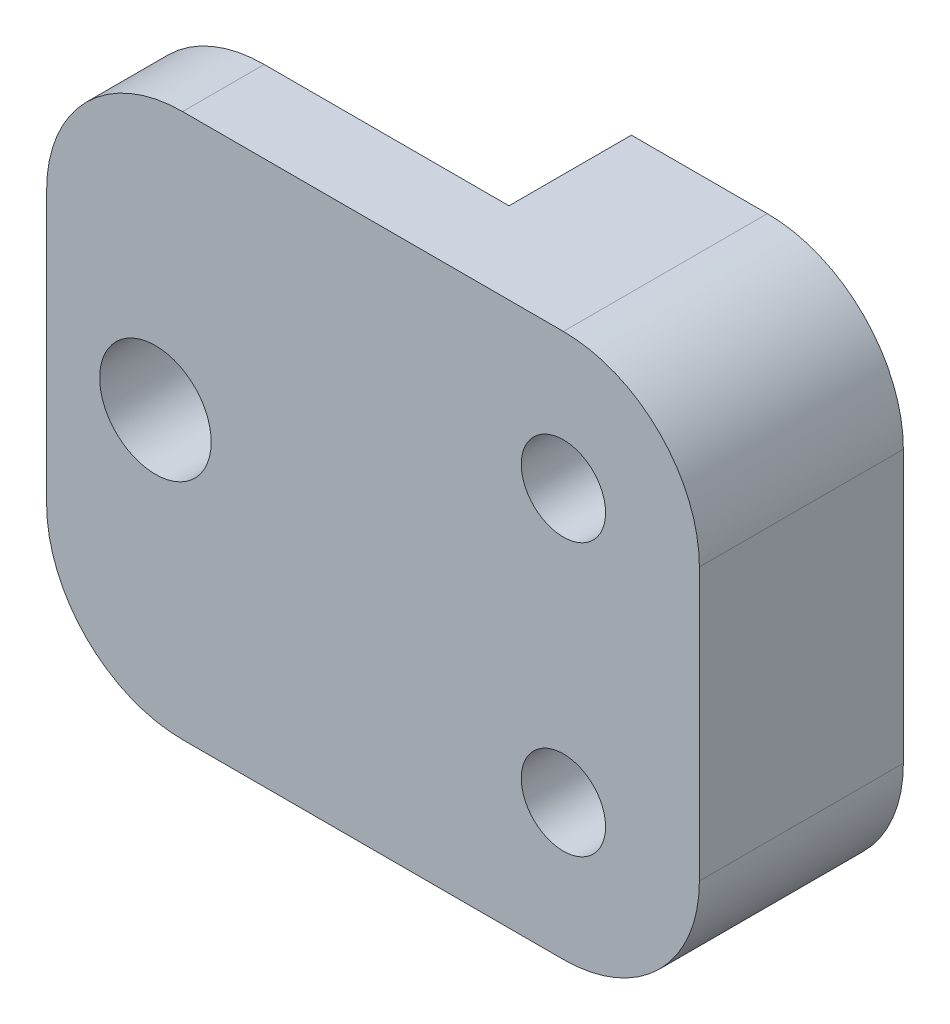
ISO-10303-21;
HEADER;
FILE_DESCRIPTION(('STEP AP214'),'2;1');
FILE_NAME('part.step','',(''),(''),'','','');
FILE_SCHEMA(('AUTOMOTIVE_DESIGN { 1 0 10303 214 1 1 1 1 }'));
ENDSEC;
DATA;
#1=APPLICATION_CONTEXT('core data for automotive mechanical design processes');
#2=APPLICATION_PROTOCOL_DEFINITION('international standard','automotive_design',2000,#1);
#3=PRODUCT_CONTEXT('',#1,'mechanical');
#4=PRODUCT('Part','Part','',(#3));
#5=PRODUCT_RELATED_PRODUCT_CATEGORY('part','',(#4));
#6=PRODUCT_DEFINITION_FORMATION('','',#4);
#7=PRODUCT_DEFINITION_CONTEXT('part definition',#1,'design');
#8=PRODUCT_DEFINITION('design','',#6,#7);
#9=PRODUCT_DEFINITION_SHAPE('','',#8);
#10=(LENGTH_UNIT() NAMED_UNIT(*) SI_UNIT(.MILLI.,.METRE.));
#11=(NAMED_UNIT(*) PLANE_ANGLE_UNIT() SI_UNIT($,.RADIAN.));
#12=(NAMED_UNIT(*) SI_UNIT($,.STERADIAN.) SOLID_ANGLE_UNIT());
#13=UNCERTAINTY_MEASURE_WITH_UNIT(LENGTH_MEASURE(1.E-05),#10,'distance_accuracy_value','');
#14=(GEOMETRIC_REPRESENTATION_CONTEXT(3) GLOBAL_UNCERTAINTY_ASSIGNED_CONTEXT((#13)) GLOBAL_UNIT_ASSIGNED_CONTEXT((#10,
#11,#12)) REPRESENTATION_CONTEXT('',''));
#15=CARTESIAN_POINT('',(0.,0.,0.));
#16=DIRECTION('',(0.,0.,1.));
#17=DIRECTION('',(1.,0.,0.));
#18=AXIS2_PLACEMENT_3D('',#15,#16,#17);
#19=CARTESIAN_POINT('',(2.,20.,0.));
#20=DIRECTION('',(1.,0.,0.));
#21=DIRECTION('',(0.,0.,-1.));
#22=AXIS2_PLACEMENT_3D('',#19,#20,#21);
#23=PLANE('',#22);
#24=DIRECTION('',(0.,0.,1.));
#25=VECTOR('',#24,1.);
#26=CARTESIAN_POINT('',(2.,0.,0.));
#27=LINE('',#26,#25);
#28=CARTESIAN_POINT('',(2.,0.,0.));
#29=VERTEX_POINT('',#28);
#30=CARTESIAN_POINT('',(2.,0.,4.5));
#31=VERTEX_POINT('',#30);
#32=EDGE_CURVE('E136',#29,#31,#27,.T.);
#33=ORIENTED_EDGE('',*,*,#32,.T.);
#34=DIRECTION('',(0.,-1.,0.));
#35=VECTOR('',#34,1.);
#36=CARTESIAN_POINT('',(2.,20.,4.5));
#37=LINE('',#36,#35);
#38=CARTESIAN_POINT('',(2.,20.,4.5));
#39=VERTEX_POINT('',#38);
#40=EDGE_CURVE('E115',#39,#31,#37,.T.);
#41=ORIENTED_EDGE('',*,*,#40,.F.);
#42=DIRECTION('',(0.,0.,1.));
#43=VECTOR('',#42,1.);
#44=CARTESIAN_POINT('',(2.,20.,0.));
#45=LINE('',#44,#43);
#46=CARTESIAN_POINT('',(2.,20.,0.));
#47=VERTEX_POINT('',#46);
#48=EDGE_CURVE('E124',#47,#39,#45,.T.);
#49=ORIENTED_EDGE('',*,*,#48,.F.);
#50=DIRECTION('',(0.,-1.,0.));
#51=VECTOR('',#50,1.);
#52=CARTESIAN_POINT('',(2.,20.,0.));
#53=LINE('',#52,#51);
#54=EDGE_CURVE('E181',#47,#29,#53,.T.);
#55=ORIENTED_EDGE('',*,*,#54,.T.);
#56=EDGE_LOOP('',(#33,#41,#49,#55));
#57=FACE_BOUND('',#56,.T.);
#58=ADVANCED_FACE('F34',(#57),#23,.F.);
#59=CARTESIAN_POINT('',(2.,20.,4.5));
#60=DIRECTION('',(0.,0.,1.));
#61=DIRECTION('',(1.,0.,0.));
#62=AXIS2_PLACEMENT_3D('',#59,#60,#61);
#63=PLANE('',#62);
#64=CARTESIAN_POINT('',(-8.,10.,4.5));
#65=DIRECTION('',(0.,0.,1.));
#66=DIRECTION('',(1.,0.,0.));
#67=AXIS2_PLACEMENT_3D('',#64,#65,#66);
#68=CIRCLE('',#67,2.05);
#69=CARTESIAN_POINT('',(-5.95,10.,4.5));
#70=VERTEX_POINT('',#69);
#71=EDGE_CURVE('E207',#70,#70,#68,.T.);
#72=ORIENTED_EDGE('',*,*,#71,.T.);
#73=EDGE_LOOP('',(#72));
#74=FACE_BOUND('',#73,.T.);
#75=DIRECTION('',(-1.,0.,0.));
#76=VECTOR('',#75,1.);
#77=CARTESIAN_POINT('',(2.,0.,4.5));
#78=LINE('',#77,#76);
#79=CARTESIAN_POINT('',(-6.99999999999999,0.,4.5));
#80=VERTEX_POINT('',#79);
#81=EDGE_CURVE('E206',#31,#80,#78,.T.);
#82=ORIENTED_EDGE('',*,*,#81,.T.);
#83=CARTESIAN_POINT('',(-7.,5.,4.5));
#84=DIRECTION('',(0.,0.,1.));
#85=DIRECTION('',(1.,0.,0.));
#86=AXIS2_PLACEMENT_3D('',#83,#84,#85);
#87=CIRCLE('',#86,5.);
#88=CARTESIAN_POINT('',(-12.,5.,4.5));
#89=VERTEX_POINT('',#88);
#90=EDGE_CURVE('E162',#80,#89,#87,.F.);
#91=ORIENTED_EDGE('',*,*,#90,.T.);
#92=DIRECTION('',(0.,-1.,0.));
#93=VECTOR('',#92,1.);
#94=CARTESIAN_POINT('',(-12.,20.,4.5));
#95=LINE('',#94,#93);
#96=CARTESIAN_POINT('',(-12.,15.,4.5));
#97=VERTEX_POINT('',#96);
#98=EDGE_CURVE('E138',#97,#89,#95,.T.);
#99=ORIENTED_EDGE('',*,*,#98,.F.);
#100=CARTESIAN_POINT('',(-7.,15.,4.5));
#101=DIRECTION('',(0.,0.,1.));
#102=DIRECTION('',(1.,0.,0.));
#103=AXIS2_PLACEMENT_3D('',#100,#101,#102);
#104=CIRCLE('',#103,5.);
#105=CARTESIAN_POINT('',(-6.99999999999999,20.,4.5));
#106=VERTEX_POINT('',#105);
#107=EDGE_CURVE('E119',#97,#106,#104,.F.);
#108=ORIENTED_EDGE('',*,*,#107,.T.);
#109=DIRECTION('',(-1.,0.,0.));
#110=VECTOR('',#109,1.);
#111=CARTESIAN_POINT('',(2.,20.,4.5));
#112=LINE('',#111,#110);
#113=EDGE_CURVE('E110',#39,#106,#112,.T.);
#114=ORIENTED_EDGE('',*,*,#113,.F.);
#115=ORIENTED_EDGE('',*,*,#40,.T.);
#116=EDGE_LOOP('',(#82,#91,#99,#108,#114,#115));
#117=FACE_BOUND('',#116,.T.);
#118=ADVANCED_FACE('F113',(#74,#117),#63,.F.);
#119=CARTESIAN_POINT('',(-12.,20.,4.5));
#120=DIRECTION('',(1.,0.,0.));
#121=DIRECTION('',(0.,0.,-1.));
#122=AXIS2_PLACEMENT_3D('',#119,#120,#121);
#123=PLANE('',#122);
#124=ORIENTED_EDGE('',*,*,#98,.T.);
#125=DIRECTION('',(0.,0.,1.));
#126=VECTOR('',#125,1.);
#127=CARTESIAN_POINT('',(-12.,5.,7.5));
#128=LINE('',#127,#126);
#129=CARTESIAN_POINT('',(-12.,5.,7.5));
#130=VERTEX_POINT('',#129);
#131=EDGE_CURVE('E140',#89,#130,#128,.T.);
#132=ORIENTED_EDGE('',*,*,#131,.T.);
#133=DIRECTION('',(0.,-1.,0.));
#134=VECTOR('',#133,1.);
#135=CARTESIAN_POINT('',(-12.,20.,7.5));
#136=LINE('',#135,#134);
#137=CARTESIAN_POINT('',(-12.,15.,7.5));
#138=VERTEX_POINT('',#137);
#139=EDGE_CURVE('E143',#138,#130,#136,.T.);
#140=ORIENTED_EDGE('',*,*,#139,.F.);
#141=DIRECTION('',(0.,0.,1.));
#142=VECTOR('',#141,1.);
#143=CARTESIAN_POINT('',(-12.,15.,4.5));
#144=LINE('',#143,#142);
#145=EDGE_CURVE('E137',#138,#97,#144,.F.);
#146=ORIENTED_EDGE('',*,*,#145,.T.);
#147=EDGE_LOOP('',(#124,#132,#140,#146));
#148=FACE_BOUND('',#147,.T.);
#149=ADVANCED_FACE('F195',(#148),#123,.F.);
#150=CARTESIAN_POINT('',(-12.,20.,7.5));
#151=DIRECTION('',(0.,0.,-1.));
#152=DIRECTION('',(-1.,0.,0.));
#153=AXIS2_PLACEMENT_3D('',#150,#151,#152);
#154=PLANE('',#153);
#155=CARTESIAN_POINT('',(-8.,10.,7.5));
#156=DIRECTION('',(0.,0.,1.));
#157=DIRECTION('',(1.,0.,0.));
#158=AXIS2_PLACEMENT_3D('',#155,#156,#157);
#159=CIRCLE('',#158,2.05);
#160=CARTESIAN_POINT('',(-5.95,10.,7.5));
#161=VERTEX_POINT('',#160);
#162=EDGE_CURVE('E268',#161,#161,#159,.T.);
#163=ORIENTED_EDGE('',*,*,#162,.F.);
#164=EDGE_LOOP('',(#163));
#165=FACE_BOUND('',#164,.T.);
#166=CARTESIAN_POINT('',(7.,15.,7.5));
#167=DIRECTION('',(0.,0.,1.));
#168=DIRECTION('',(1.,0.,0.));
#169=AXIS2_PLACEMENT_3D('',#166,#167,#168);
#170=CIRCLE('',#169,1.55);
#171=CARTESIAN_POINT('',(8.55,15.,7.5));
#172=VERTEX_POINT('',#171);
#173=EDGE_CURVE('E264',#172,#172,#170,.T.);
#174=ORIENTED_EDGE('',*,*,#173,.F.);
#175=EDGE_LOOP('',(#174));
#176=FACE_BOUND('',#175,.T.);
#177=CARTESIAN_POINT('',(7.,5.,7.5));
#178=DIRECTION('',(0.,0.,1.));
#179=DIRECTION('',(1.,0.,0.));
#180=AXIS2_PLACEMENT_3D('',#177,#178,#179);
#181=CIRCLE('',#180,1.55);
#182=CARTESIAN_POINT('',(8.55,5.,7.5));
#183=VERTEX_POINT('',#182);
#184=EDGE_CURVE('E271',#183,#183,#181,.T.);
#185=ORIENTED_EDGE('',*,*,#184,.F.);
#186=EDGE_LOOP('',(#185));
#187=FACE_BOUND('',#186,.T.);
#188=ORIENTED_EDGE('',*,*,#139,.T.);
#189=CARTESIAN_POINT('',(-7.,5.,7.5));
#190=DIRECTION('',(0.,0.,-1.));
#191=DIRECTION('',(-1.,0.,0.));
#192=AXIS2_PLACEMENT_3D('',#189,#190,#191);
#193=CIRCLE('',#192,5.);
#194=CARTESIAN_POINT('',(-7.,0.,7.5));
#195=VERTEX_POINT('',#194);
#196=EDGE_CURVE('E155',#130,#195,#193,.F.);
#197=ORIENTED_EDGE('',*,*,#196,.T.);
#198=DIRECTION('',(1.,0.,0.));
#199=VECTOR('',#198,1.);
#200=CARTESIAN_POINT('',(-12.,0.,7.5));
#201=LINE('',#200,#199);
#202=CARTESIAN_POINT('',(7.,0.,7.5));
#203=VERTEX_POINT('',#202);
#204=EDGE_CURVE('E209',#195,#203,#201,.T.);
#205=ORIENTED_EDGE('',*,*,#204,.T.);
#206=CARTESIAN_POINT('',(7.,5.,7.5));
#207=DIRECTION('',(0.,0.,-1.));
#208=DIRECTION('',(-1.,0.,0.));
#209=AXIS2_PLACEMENT_3D('',#206,#207,#208);
#210=CIRCLE('',#209,5.);
#211=CARTESIAN_POINT('',(12.,5.,7.5));
#212=VERTEX_POINT('',#211);
#213=EDGE_CURVE('E151',#203,#212,#210,.F.);
#214=ORIENTED_EDGE('',*,*,#213,.T.);
#215=DIRECTION('',(0.,-1.,0.));
#216=VECTOR('',#215,1.);
#217=CARTESIAN_POINT('',(12.,20.,7.5));
#218=LINE('',#217,#216);
#219=CARTESIAN_POINT('',(12.,15.,7.5));
#220=VERTEX_POINT('',#219);
#221=EDGE_CURVE('E177',#220,#212,#218,.T.);
#222=ORIENTED_EDGE('',*,*,#221,.F.);
#223=CARTESIAN_POINT('',(7.,15.,7.5));
#224=DIRECTION('',(0.,0.,-1.));
#225=DIRECTION('',(-1.,0.,0.));
#226=AXIS2_PLACEMENT_3D('',#223,#224,#225);
#227=CIRCLE('',#226,5.);
#228=CARTESIAN_POINT('',(7.,20.,7.5));
#229=VERTEX_POINT('',#228);
#230=EDGE_CURVE('E149',#220,#229,#227,.F.);
#231=ORIENTED_EDGE('',*,*,#230,.T.);
#232=DIRECTION('',(1.,0.,0.));
#233=VECTOR('',#232,1.);
#234=CARTESIAN_POINT('',(-12.,20.,7.5));
#235=LINE('',#234,#233);
#236=CARTESIAN_POINT('',(-7.,20.,7.5));
#237=VERTEX_POINT('',#236);
#238=EDGE_CURVE('E123',#237,#229,#235,.T.);
#239=ORIENTED_EDGE('',*,*,#238,.F.);
#240=CARTESIAN_POINT('',(-7.,15.,7.5));
#241=DIRECTION('',(0.,0.,-1.));
#242=DIRECTION('',(-1.,0.,0.));
#243=AXIS2_PLACEMENT_3D('',#240,#241,#242);
#244=CIRCLE('',#243,5.);
#245=EDGE_CURVE('E153',#237,#138,#244,.F.);
#246=ORIENTED_EDGE('',*,*,#245,.T.);
#247=EDGE_LOOP('',(#188,#197,#205,#214,#222,#231,#239,#246));
#248=FACE_BOUND('',#247,.T.);
#249=ADVANCED_FACE('F189',(#165,#176,#187,#248),#154,.F.);
#250=CARTESIAN_POINT('',(12.,20.,0.));
#251=DIRECTION('',(-1.,0.,0.));
#252=DIRECTION('',(0.,0.,1.));
#253=AXIS2_PLACEMENT_3D('',#250,#251,#252);
#254=PLANE('',#253);
#255=ORIENTED_EDGE('',*,*,#221,.T.);
#256=DIRECTION('',(0.,0.,-1.));
#257=VECTOR('',#256,1.);
#258=CARTESIAN_POINT('',(12.,5.,0.));
#259=LINE('',#258,#257);
#260=CARTESIAN_POINT('',(12.,5.,0.));
#261=VERTEX_POINT('',#260);
#262=EDGE_CURVE('E170',#212,#261,#259,.T.);
#263=ORIENTED_EDGE('',*,*,#262,.T.);
#264=DIRECTION('',(0.,-1.,0.));
#265=VECTOR('',#264,1.);
#266=CARTESIAN_POINT('',(12.,20.,0.));
#267=LINE('',#266,#265);
#268=CARTESIAN_POINT('',(12.,15.,0.));
#269=VERTEX_POINT('',#268);
#270=EDGE_CURVE('E174',#269,#261,#267,.T.);
#271=ORIENTED_EDGE('',*,*,#270,.F.);
#272=DIRECTION('',(0.,0.,-1.));
#273=VECTOR('',#272,1.);
#274=CARTESIAN_POINT('',(12.,15.,0.));
#275=LINE('',#274,#273);
#276=EDGE_CURVE('E168',#269,#220,#275,.F.);
#277=ORIENTED_EDGE('',*,*,#276,.T.);
#278=EDGE_LOOP('',(#255,#263,#271,#277));
#279=FACE_BOUND('',#278,.T.);
#280=ADVANCED_FACE('F173',(#279),#254,.F.);
#281=CARTESIAN_POINT('',(2.,20.,0.));
#282=DIRECTION('',(0.,0.,1.));
#283=DIRECTION('',(1.,0.,0.));
#284=AXIS2_PLACEMENT_3D('',#281,#282,#283);
#285=PLANE('',#284);
#286=CARTESIAN_POINT('',(7.,15.,0.));
#287=DIRECTION('',(0.,0.,1.));
#288=DIRECTION('',(1.,0.,0.));
#289=AXIS2_PLACEMENT_3D('',#286,#287,#288);
#290=CIRCLE('',#289,1.55);
#291=CARTESIAN_POINT('',(8.55,15.,0.));
#292=VERTEX_POINT('',#291);
#293=EDGE_CURVE('E261',#292,#292,#290,.T.);
#294=ORIENTED_EDGE('',*,*,#293,.T.);
#295=EDGE_LOOP('',(#294));
#296=FACE_BOUND('',#295,.T.);
#297=CARTESIAN_POINT('',(7.,5.,0.));
#298=DIRECTION('',(0.,0.,1.));
#299=DIRECTION('',(1.,0.,0.));
#300=AXIS2_PLACEMENT_3D('',#297,#298,#299);
#301=CIRCLE('',#300,1.55);
#302=CARTESIAN_POINT('',(8.55,5.,0.));
#303=VERTEX_POINT('',#302);
#304=EDGE_CURVE('E266',#303,#303,#301,.T.);
#305=ORIENTED_EDGE('',*,*,#304,.T.);
#306=EDGE_LOOP('',(#305));
#307=FACE_BOUND('',#306,.T.);
#308=ORIENTED_EDGE('',*,*,#270,.T.);
#309=CARTESIAN_POINT('',(7.,5.,0.));
#310=DIRECTION('',(0.,0.,1.));
#311=DIRECTION('',(1.,0.,0.));
#312=AXIS2_PLACEMENT_3D('',#309,#310,#311);
#313=CIRCLE('',#312,5.);
#314=CARTESIAN_POINT('',(7.,0.,0.));
#315=VERTEX_POINT('',#314);
#316=EDGE_CURVE('E11',#261,#315,#313,.F.);
#317=ORIENTED_EDGE('',*,*,#316,.T.);
#318=DIRECTION('',(-1.,0.,0.));
#319=VECTOR('',#318,1.);
#320=CARTESIAN_POINT('',(2.,0.,0.));
#321=LINE('',#320,#319);
#322=EDGE_CURVE('E133',#315,#29,#321,.T.);
#323=ORIENTED_EDGE('',*,*,#322,.T.);
#324=ORIENTED_EDGE('',*,*,#54,.F.);
#325=DIRECTION('',(-1.,0.,0.));
#326=VECTOR('',#325,1.);
#327=CARTESIAN_POINT('',(2.,20.,0.));
#328=LINE('',#327,#326);
#329=CARTESIAN_POINT('',(7.,20.,0.));
#330=VERTEX_POINT('',#329);
#331=EDGE_CURVE('E129',#330,#47,#328,.T.);
#332=ORIENTED_EDGE('',*,*,#331,.F.);
#333=CARTESIAN_POINT('',(7.,15.,0.));
#334=DIRECTION('',(0.,0.,1.));
#335=DIRECTION('',(1.,0.,0.));
#336=AXIS2_PLACEMENT_3D('',#333,#334,#335);
#337=CIRCLE('',#336,5.);
#338=EDGE_CURVE('E42',#330,#269,#337,.F.);
#339=ORIENTED_EDGE('',*,*,#338,.T.);
#340=EDGE_LOOP('',(#308,#317,#323,#324,#332,#339));
#341=FACE_BOUND('',#340,.T.);
#342=ADVANCED_FACE('F179',(#296,#307,#341),#285,.F.);
#343=CARTESIAN_POINT('',(0.,20.,0.));
#344=DIRECTION('',(0.,-1.,0.));
#345=DIRECTION('',(0.,0.,-1.));
#346=AXIS2_PLACEMENT_3D('',#343,#344,#345);
#347=PLANE('',#346);
#348=ORIENTED_EDGE('',*,*,#113,.T.);
#349=DIRECTION('',(0.,0.,1.));
#350=VECTOR('',#349,1.);
#351=CARTESIAN_POINT('',(-7.,20.,0.));
#352=LINE('',#351,#350);
#353=EDGE_CURVE('E166',#106,#237,#352,.T.);
#354=ORIENTED_EDGE('',*,*,#353,.T.);
#355=ORIENTED_EDGE('',*,*,#238,.T.);
#356=DIRECTION('',(0.,0.,-1.));
#357=VECTOR('',#356,1.);
#358=CARTESIAN_POINT('',(7.,20.,0.));
#359=LINE('',#358,#357);
#360=EDGE_CURVE('E164',#229,#330,#359,.T.);
#361=ORIENTED_EDGE('',*,*,#360,.T.);
#362=ORIENTED_EDGE('',*,*,#331,.T.);
#363=ORIENTED_EDGE('',*,*,#48,.T.);
#364=EDGE_LOOP('',(#348,#354,#355,#361,#362,#363));
#365=FACE_BOUND('',#364,.T.);
#366=ADVANCED_FACE('F127',(#365),#347,.F.);
#367=CARTESIAN_POINT('',(0.,0.,0.));
#368=DIRECTION('',(0.,-1.,0.));
#369=DIRECTION('',(0.,0.,-1.));
#370=AXIS2_PLACEMENT_3D('',#367,#368,#369);
#371=PLANE('',#370);
#372=ORIENTED_EDGE('',*,*,#204,.F.);
#373=DIRECTION('',(0.,0.,1.));
#374=VECTOR('',#373,1.);
#375=CARTESIAN_POINT('',(-7.,0.,4.5));
#376=LINE('',#375,#374);
#377=EDGE_CURVE('E159',#195,#80,#376,.F.);
#378=ORIENTED_EDGE('',*,*,#377,.T.);
#379=ORIENTED_EDGE('',*,*,#81,.F.);
#380=ORIENTED_EDGE('',*,*,#32,.F.);
#381=ORIENTED_EDGE('',*,*,#322,.F.);
#382=DIRECTION('',(0.,0.,-1.));
#383=VECTOR('',#382,1.);
#384=CARTESIAN_POINT('',(7.,0.,7.5));
#385=LINE('',#384,#383);
#386=EDGE_CURVE('E157',#315,#203,#385,.F.);
#387=ORIENTED_EDGE('',*,*,#386,.T.);
#388=EDGE_LOOP('',(#372,#378,#379,#380,#381,#387));
#389=FACE_BOUND('',#388,.T.);
#390=ADVANCED_FACE('F211',(#389),#371,.T.);
#391=CARTESIAN_POINT('',(7.,5.,0.));
#392=DIRECTION('',(0.,0.,1.));
#393=DIRECTION('',(1.,0.,0.));
#394=AXIS2_PLACEMENT_3D('',#391,#392,#393);
#395=CYLINDRICAL_SURFACE('',#394,1.55);
#396=CARTESIAN_POINT('',(8.55,5.,0.));
#397=CARTESIAN_POINT('',(8.55,5.,0.078125));
#398=CARTESIAN_POINT('',(8.55,5.,0.15625));
#399=CARTESIAN_POINT('',(8.55,5.,0.3125));
#400=CARTESIAN_POINT('',(8.55,5.,0.390625));
#401=CARTESIAN_POINT('',(8.55,5.,0.546875));
#402=CARTESIAN_POINT('',(8.55,5.,0.625));
#403=CARTESIAN_POINT('',(8.55,5.,0.78125));
#404=CARTESIAN_POINT('',(8.55,5.,0.859375));
#405=CARTESIAN_POINT('',(8.55,5.,1.015625));
#406=CARTESIAN_POINT('',(8.55,5.,1.09375));
#407=CARTESIAN_POINT('',(8.55,5.,1.25));
#408=CARTESIAN_POINT('',(8.55,5.,1.328125));
#409=CARTESIAN_POINT('',(8.55,5.,1.484375));
#410=CARTESIAN_POINT('',(8.55,5.,1.5625));
#411=CARTESIAN_POINT('',(8.55,5.,1.71875));
#412=CARTESIAN_POINT('',(8.55,5.,1.796875));
#413=CARTESIAN_POINT('',(8.55,5.,1.953125));
#414=CARTESIAN_POINT('',(8.55,5.,2.03125));
#415=CARTESIAN_POINT('',(8.55,5.,2.1875));
#416=CARTESIAN_POINT('',(8.55,5.,2.265625));
#417=CARTESIAN_POINT('',(8.55,5.,2.421875));
#418=CARTESIAN_POINT('',(8.55,5.,2.5));
#419=CARTESIAN_POINT('',(8.55,5.,2.65625));
#420=CARTESIAN_POINT('',(8.55,5.,2.734375));
#421=CARTESIAN_POINT('',(8.55,5.,2.890625));
#422=CARTESIAN_POINT('',(8.55,5.,2.96875));
#423=CARTESIAN_POINT('',(8.55,5.,3.125));
#424=CARTESIAN_POINT('',(8.55,5.,3.203125));
#425=CARTESIAN_POINT('',(8.55,5.,3.359375));
#426=CARTESIAN_POINT('',(8.55,5.,3.4375));
#427=CARTESIAN_POINT('',(8.55,5.,3.59375));
#428=CARTESIAN_POINT('',(8.55,5.,3.671875));
#429=CARTESIAN_POINT('',(8.55,5.,3.828125));
#430=CARTESIAN_POINT('',(8.55,5.,3.90625));
#431=CARTESIAN_POINT('',(8.55,5.,4.0625));
#432=CARTESIAN_POINT('',(8.55,5.,4.140625));
#433=CARTESIAN_POINT('',(8.55,5.,4.296875));
#434=CARTESIAN_POINT('',(8.55,5.,4.375));
#435=CARTESIAN_POINT('',(8.55,5.,4.53125));
#436=CARTESIAN_POINT('',(8.55,5.,4.609375));
#437=CARTESIAN_POINT('',(8.55,5.,4.765625));
#438=CARTESIAN_POINT('',(8.55,5.,4.84375));
#439=CARTESIAN_POINT('',(8.55,5.,5.));
#440=CARTESIAN_POINT('',(8.55,5.,5.078125));
#441=CARTESIAN_POINT('',(8.55,5.,5.234375));
#442=CARTESIAN_POINT('',(8.55,5.,5.3125));
#443=CARTESIAN_POINT('',(8.55,5.,5.46875));
#444=CARTESIAN_POINT('',(8.55,5.,5.546875));
#445=CARTESIAN_POINT('',(8.55,5.,5.703125));
#446=CARTESIAN_POINT('',(8.55,5.,5.78125));
#447=CARTESIAN_POINT('',(8.55,5.,5.9375));
#448=CARTESIAN_POINT('',(8.55,5.,6.015625));
#449=CARTESIAN_POINT('',(8.55,5.,6.171875));
#450=CARTESIAN_POINT('',(8.55,5.,6.25));
#451=CARTESIAN_POINT('',(8.55,5.,6.40625));
#452=CARTESIAN_POINT('',(8.55,5.,6.484375));
#453=CARTESIAN_POINT('',(8.55,5.,6.640625));
#454=CARTESIAN_POINT('',(8.55,5.,6.71875));
#455=CARTESIAN_POINT('',(8.55,5.,6.875));
#456=CARTESIAN_POINT('',(8.55,5.,6.953125));
#457=CARTESIAN_POINT('',(8.55,5.,7.109375));
#458=CARTESIAN_POINT('',(8.55,5.,7.1875));
#459=CARTESIAN_POINT('',(8.55,5.,7.34375));
#460=CARTESIAN_POINT('',(8.55,5.,7.421875));
#461=CARTESIAN_POINT('',(8.55,5.,7.5));
#462=B_SPLINE_CURVE_WITH_KNOTS('',3,(#396,#397,#398,#399,#400,#401,#402,#403,#404,#405,#406,
#407,#408,#409,#410,#411,#412,#413,#414,#415,#416,#417,#418,#419,#420,#421,#422,#423,#424,#425,
#426,#427,#428,#429,#430,#431,#432,#433,#434,#435,#436,#437,#438,#439,#440,#441,#442,#443,#444,
#445,#446,#447,#448,#449,#450,#451,#452,#453,#454,#455,#456,#457,#458,#459,#460,#461),
.UNSPECIFIED.,.F.,.F.,(4,2,2,2,2,2,2,2,2,2,2,2,2,2,2,2,2,2,2,2,2,2,2,2,2,2,2,2,2,2,2,2,4),(0.,
0.234375,0.46875,0.703125,0.9375,1.171875,1.40625,1.640625,1.875,2.109375,2.34375,2.578125,
2.8125,3.046875,3.28125,3.515625,3.75,3.984375,4.21875,4.453125,4.6875,4.921875,5.15625,
5.390625,5.625,5.859375,6.09375,6.328125,6.5625,6.796875,7.03125,7.265625,7.5),.UNSPECIFIED.);
#463=EDGE_CURVE('BSEAM248',#303,#183,#462,.T.);
#464=ORIENTED_EDGE('',*,*,#304,.F.);
#465=ORIENTED_EDGE('',*,*,#184,.T.);
#466=ORIENTED_EDGE('',*,*,#463,.T.);
#467=ORIENTED_EDGE('',*,*,#463,.F.);
#468=EDGE_LOOP('',(#464,#466,#465,#467));
#469=FACE_BOUND('',#468,.T.);
#470=ADVANCED_FACE('F248',(#469),#395,.F.);
#471=CARTESIAN_POINT('',(7.,15.,0.));
#472=DIRECTION('',(0.,0.,1.));
#473=DIRECTION('',(1.,0.,0.));
#474=AXIS2_PLACEMENT_3D('',#471,#472,#473);
#475=CYLINDRICAL_SURFACE('',#474,1.55);
#476=CARTESIAN_POINT('',(8.55,15.,0.));
#477=CARTESIAN_POINT('',(8.55,15.,0.078125));
#478=CARTESIAN_POINT('',(8.55,15.,0.15625));
#479=CARTESIAN_POINT('',(8.55,15.,0.3125));
#480=CARTESIAN_POINT('',(8.55,15.,0.390625));
#481=CARTESIAN_POINT('',(8.55,15.,0.546875));
#482=CARTESIAN_POINT('',(8.55,15.,0.625));
#483=CARTESIAN_POINT('',(8.55,15.,0.78125));
#484=CARTESIAN_POINT('',(8.55,15.,0.859375));
#485=CARTESIAN_POINT('',(8.55,15.,1.015625));
#486=CARTESIAN_POINT('',(8.55,15.,1.09375));
#487=CARTESIAN_POINT('',(8.55,15.,1.25));
#488=CARTESIAN_POINT('',(8.55,15.,1.328125));
#489=CARTESIAN_POINT('',(8.55,15.,1.484375));
#490=CARTESIAN_POINT('',(8.55,15.,1.5625));
#491=CARTESIAN_POINT('',(8.55,15.,1.71875));
#492=CARTESIAN_POINT('',(8.55,15.,1.796875));
#493=CARTESIAN_POINT('',(8.55,15.,1.953125));
#494=CARTESIAN_POINT('',(8.55,15.,2.03125));
#495=CARTESIAN_POINT('',(8.55,15.,2.1875));
#496=CARTESIAN_POINT('',(8.55,15.,2.265625));
#497=CARTESIAN_POINT('',(8.55,15.,2.421875));
#498=CARTESIAN_POINT('',(8.55,15.,2.5));
#499=CARTESIAN_POINT('',(8.55,15.,2.65625));
#500=CARTESIAN_POINT('',(8.55,15.,2.734375));
#501=CARTESIAN_POINT('',(8.55,15.,2.890625));
#502=CARTESIAN_POINT('',(8.55,15.,2.96875));
#503=CARTESIAN_POINT('',(8.55,15.,3.125));
#504=CARTESIAN_POINT('',(8.55,15.,3.203125));
#505=CARTESIAN_POINT('',(8.55,15.,3.359375));
#506=CARTESIAN_POINT('',(8.55,15.,3.4375));
#507=CARTESIAN_POINT('',(8.55,15.,3.59375));
#508=CARTESIAN_POINT('',(8.55,15.,3.671875));
#509=CARTESIAN_POINT('',(8.55,15.,3.828125));
#510=CARTESIAN_POINT('',(8.55,15.,3.90625));
#511=CARTESIAN_POINT('',(8.55,15.,4.0625));
#512=CARTESIAN_POINT('',(8.55,15.,4.140625));
#513=CARTESIAN_POINT('',(8.55,15.,4.296875));
#514=CARTESIAN_POINT('',(8.55,15.,4.375));
#515=CARTESIAN_POINT('',(8.55,15.,4.53125));
#516=CARTESIAN_POINT('',(8.55,15.,4.609375));
#517=CARTESIAN_POINT('',(8.55,15.,4.765625));
#518=CARTESIAN_POINT('',(8.55,15.,4.84375));
#519=CARTESIAN_POINT('',(8.55,15.,5.));
#520=CARTESIAN_POINT('',(8.55,15.,5.078125));
#521=CARTESIAN_POINT('',(8.55,15.,5.234375));
#522=CARTESIAN_POINT('',(8.55,15.,5.3125));
#523=CARTESIAN_POINT('',(8.55,15.,5.46875));
#524=CARTESIAN_POINT('',(8.55,15.,5.546875));
#525=CARTESIAN_POINT('',(8.55,15.,5.703125));
#526=CARTESIAN_POINT('',(8.55,15.,5.78125));
#527=CARTESIAN_POINT('',(8.55,15.,5.9375));
#528=CARTESIAN_POINT('',(8.55,15.,6.015625));
#529=CARTESIAN_POINT('',(8.55,15.,6.171875));
#530=CARTESIAN_POINT('',(8.55,15.,6.25));
#531=CARTESIAN_POINT('',(8.55,15.,6.40625));
#532=CARTESIAN_POINT('',(8.55,15.,6.484375));
#533=CARTESIAN_POINT('',(8.55,15.,6.640625));
#534=CARTESIAN_POINT('',(8.55,15.,6.71875));
#535=CARTESIAN_POINT('',(8.55,15.,6.875));
#536=CARTESIAN_POINT('',(8.55,15.,6.953125));
#537=CARTESIAN_POINT('',(8.55,15.,7.109375));
#538=CARTESIAN_POINT('',(8.55,15.,7.1875));
#539=CARTESIAN_POINT('',(8.55,15.,7.34375));
#540=CARTESIAN_POINT('',(8.55,15.,7.421875));
#541=CARTESIAN_POINT('',(8.55,15.,7.5));
#542=B_SPLINE_CURVE_WITH_KNOTS('',3,(#476,#477,#478,#479,#480,#481,#482,#483,#484,#485,#486,
#487,#488,#489,#490,#491,#492,#493,#494,#495,#496,#497,#498,#499,#500,#501,#502,#503,#504,#505,
#506,#507,#508,#509,#510,#511,#512,#513,#514,#515,#516,#517,#518,#519,#520,#521,#522,#523,#524,
#525,#526,#527,#528,#529,#530,#531,#532,#533,#534,#535,#536,#537,#538,#539,#540,#541),
.UNSPECIFIED.,.F.,.F.,(4,2,2,2,2,2,2,2,2,2,2,2,2,2,2,2,2,2,2,2,2,2,2,2,2,2,2,2,2,2,2,2,4),(0.,
0.234375,0.46875,0.703125,0.9375,1.171875,1.40625,1.640625,1.875,2.109375,2.34375,2.578125,
2.8125,3.046875,3.28125,3.515625,3.75,3.984375,4.21875,4.453125,4.6875,4.921875,5.15625,
5.390625,5.625,5.859375,6.09375,6.328125,6.5625,6.796875,7.03125,7.265625,7.5),.UNSPECIFIED.);
#543=EDGE_CURVE('BSEAM225',#292,#172,#542,.T.);
#544=ORIENTED_EDGE('',*,*,#293,.F.);
#545=ORIENTED_EDGE('',*,*,#173,.T.);
#546=ORIENTED_EDGE('',*,*,#543,.T.);
#547=ORIENTED_EDGE('',*,*,#543,.F.);
#548=EDGE_LOOP('',(#544,#546,#545,#547));
#549=FACE_BOUND('',#548,.T.);
#550=ADVANCED_FACE('F225',(#549),#475,.F.);
#551=CARTESIAN_POINT('',(-8.,10.,0.));
#552=DIRECTION('',(0.,0.,1.));
#553=DIRECTION('',(1.,0.,0.));
#554=AXIS2_PLACEMENT_3D('',#551,#552,#553);
#555=CYLINDRICAL_SURFACE('',#554,2.05);
#556=CARTESIAN_POINT('',(-5.95,10.,7.5));
#557=CARTESIAN_POINT('',(-5.95,10.,7.46875));
#558=CARTESIAN_POINT('',(-5.95,10.,7.4375));
#559=CARTESIAN_POINT('',(-5.95,10.,7.375));
#560=CARTESIAN_POINT('',(-5.95,10.,7.34375));
#561=CARTESIAN_POINT('',(-5.95,10.,7.28125));
#562=CARTESIAN_POINT('',(-5.95,10.,7.25));
#563=CARTESIAN_POINT('',(-5.95,10.,7.1875));
#564=CARTESIAN_POINT('',(-5.95,10.,7.15625));
#565=CARTESIAN_POINT('',(-5.95,10.,7.09375));
#566=CARTESIAN_POINT('',(-5.95,10.,7.0625));
#567=CARTESIAN_POINT('',(-5.95,10.,7.));
#568=CARTESIAN_POINT('',(-5.95,10.,6.96875));
#569=CARTESIAN_POINT('',(-5.95,10.,6.90625));
#570=CARTESIAN_POINT('',(-5.95,10.,6.875));
#571=CARTESIAN_POINT('',(-5.95,10.,6.8125));
#572=CARTESIAN_POINT('',(-5.95,10.,6.78125));
#573=CARTESIAN_POINT('',(-5.95,10.,6.71875));
#574=CARTESIAN_POINT('',(-5.95,10.,6.6875));
#575=CARTESIAN_POINT('',(-5.95,10.,6.625));
#576=CARTESIAN_POINT('',(-5.95,10.,6.59375));
#577=CARTESIAN_POINT('',(-5.95,10.,6.53125));
#578=CARTESIAN_POINT('',(-5.95,10.,6.5));
#579=CARTESIAN_POINT('',(-5.95,10.,6.4375));
#580=CARTESIAN_POINT('',(-5.95,10.,6.40625));
#581=CARTESIAN_POINT('',(-5.95,10.,6.34375));
#582=CARTESIAN_POINT('',(-5.95,10.,6.3125));
#583=CARTESIAN_POINT('',(-5.95,10.,6.25));
#584=CARTESIAN_POINT('',(-5.95,10.,6.21875));
#585=CARTESIAN_POINT('',(-5.95,10.,6.15625));
#586=CARTESIAN_POINT('',(-5.95,10.,6.125));
#587=CARTESIAN_POINT('',(-5.95,10.,6.0625));
#588=CARTESIAN_POINT('',(-5.95,10.,6.03125));
#589=CARTESIAN_POINT('',(-5.95,10.,5.96875));
#590=CARTESIAN_POINT('',(-5.95,10.,5.9375));
#591=CARTESIAN_POINT('',(-5.95,10.,5.875));
#592=CARTESIAN_POINT('',(-5.95,10.,5.84375));
#593=CARTESIAN_POINT('',(-5.95,10.,5.78125));
#594=CARTESIAN_POINT('',(-5.95,10.,5.75));
#595=CARTESIAN_POINT('',(-5.95,10.,5.6875));
#596=CARTESIAN_POINT('',(-5.95,10.,5.65625));
#597=CARTESIAN_POINT('',(-5.95,10.,5.59375));
#598=CARTESIAN_POINT('',(-5.95,10.,5.5625));
#599=CARTESIAN_POINT('',(-5.95,10.,5.5));
#600=CARTESIAN_POINT('',(-5.95,10.,5.46875));
#601=CARTESIAN_POINT('',(-5.95,10.,5.40625));
#602=CARTESIAN_POINT('',(-5.95,10.,5.375));
#603=CARTESIAN_POINT('',(-5.95,10.,5.3125));
#604=CARTESIAN_POINT('',(-5.95,10.,5.28125));
#605=CARTESIAN_POINT('',(-5.95,10.,5.21875));
#606=CARTESIAN_POINT('',(-5.95,10.,5.1875));
#607=CARTESIAN_POINT('',(-5.95,10.,5.125));
#608=CARTESIAN_POINT('',(-5.95,10.,5.09375));
#609=CARTESIAN_POINT('',(-5.95,10.,5.03125));
#610=CARTESIAN_POINT('',(-5.95,10.,5.));
#611=CARTESIAN_POINT('',(-5.95,10.,4.9375));
#612=CARTESIAN_POINT('',(-5.95,10.,4.90625));
#613=CARTESIAN_POINT('',(-5.95,10.,4.84375));
#614=CARTESIAN_POINT('',(-5.95,10.,4.8125));
#615=CARTESIAN_POINT('',(-5.95,10.,4.75));
#616=CARTESIAN_POINT('',(-5.95,10.,4.71875));
#617=CARTESIAN_POINT('',(-5.95,10.,4.65625));
#618=CARTESIAN_POINT('',(-5.95,10.,4.625));
#619=CARTESIAN_POINT('',(-5.95,10.,4.5625));
#620=CARTESIAN_POINT('',(-5.95,10.,4.53125));
#621=CARTESIAN_POINT('',(-5.95,10.,4.5));
#622=B_SPLINE_CURVE_WITH_KNOTS('',3,(#556,#557,#558,#559,#560,#561,#562,#563,#564,#565,#566,
#567,#568,#569,#570,#571,#572,#573,#574,#575,#576,#577,#578,#579,#580,#581,#582,#583,#584,#585,
#586,#587,#588,#589,#590,#591,#592,#593,#594,#595,#596,#597,#598,#599,#600,#601,#602,#603,#604,
#605,#606,#607,#608,#609,#610,#611,#612,#613,#614,#615,#616,#617,#618,#619,#620,#621),
.UNSPECIFIED.,.F.,.F.,(4,2,2,2,2,2,2,2,2,2,2,2,2,2,2,2,2,2,2,2,2,2,2,2,2,2,2,2,2,2,2,2,4),(0.,
0.0937500000000001,0.1875,0.28125,0.375,0.46875,0.5625,0.656250000000001,0.750000000000001,
0.843750000000001,0.9375,1.03125,1.125,1.21875,1.3125,1.40625,1.5,1.59375,1.6875,1.78125,1.875,
1.96875,2.0625,2.15625,2.25,2.34375,2.4375,2.53125,2.625,2.71875,2.8125,2.90625,3.),.UNSPECIFIED.);
#623=EDGE_CURVE('BSEAM217',#161,#70,#622,.T.);
#624=ORIENTED_EDGE('',*,*,#162,.T.);
#625=ORIENTED_EDGE('',*,*,#71,.F.);
#626=ORIENTED_EDGE('',*,*,#623,.T.);
#627=ORIENTED_EDGE('',*,*,#623,.F.);
#628=EDGE_LOOP('',(#624,#626,#625,#627));
#629=FACE_BOUND('',#628,.T.);
#630=ADVANCED_FACE('F217',(#629),#555,.F.);
#631=CARTESIAN_POINT('',(-7.,5.,4.5));
#632=DIRECTION('',(0.,0.,-1.));
#633=DIRECTION('',(-1.,0.,0.));
#634=AXIS2_PLACEMENT_3D('',#631,#632,#633);
#635=CYLINDRICAL_SURFACE('',#634,5.);
#636=ORIENTED_EDGE('',*,*,#90,.F.);
#637=ORIENTED_EDGE('',*,*,#377,.F.);
#638=ORIENTED_EDGE('',*,*,#196,.F.);
#639=ORIENTED_EDGE('',*,*,#131,.F.);
#640=EDGE_LOOP('',(#636,#637,#638,#639));
#641=FACE_BOUND('',#640,.T.);
#642=ADVANCED_FACE('F215',(#641),#635,.T.);
#643=CARTESIAN_POINT('',(-7.,15.,0.));
#644=DIRECTION('',(0.,0.,1.));
#645=DIRECTION('',(1.,0.,0.));
#646=AXIS2_PLACEMENT_3D('',#643,#644,#645);
#647=CYLINDRICAL_SURFACE('',#646,5.);
#648=ORIENTED_EDGE('',*,*,#107,.F.);
#649=ORIENTED_EDGE('',*,*,#145,.F.);
#650=ORIENTED_EDGE('',*,*,#245,.F.);
#651=ORIENTED_EDGE('',*,*,#353,.F.);
#652=EDGE_LOOP('',(#648,#649,#650,#651));
#653=FACE_BOUND('',#652,.T.);
#654=ADVANCED_FACE('F198',(#653),#647,.T.);
#655=CARTESIAN_POINT('',(7.,5.,0.));
#656=DIRECTION('',(0.,0.,1.));
#657=DIRECTION('',(1.,0.,0.));
#658=AXIS2_PLACEMENT_3D('',#655,#656,#657);
#659=CYLINDRICAL_SURFACE('',#658,5.);
#660=ORIENTED_EDGE('',*,*,#213,.F.);
#661=ORIENTED_EDGE('',*,*,#386,.F.);
#662=ORIENTED_EDGE('',*,*,#316,.F.);
#663=ORIENTED_EDGE('',*,*,#262,.F.);
#664=EDGE_LOOP('',(#660,#661,#662,#663));
#665=FACE_BOUND('',#664,.T.);
#666=ADVANCED_FACE('F223',(#665),#659,.T.);
#667=CARTESIAN_POINT('',(7.,15.,0.));
#668=DIRECTION('',(0.,0.,-1.));
#669=DIRECTION('',(-1.,0.,0.));
#670=AXIS2_PLACEMENT_3D('',#667,#668,#669);
#671=CYLINDRICAL_SURFACE('',#670,5.);
#672=ORIENTED_EDGE('',*,*,#230,.F.);
#673=ORIENTED_EDGE('',*,*,#276,.F.);
#674=ORIENTED_EDGE('',*,*,#338,.F.);
#675=ORIENTED_EDGE('',*,*,#360,.F.);
#676=EDGE_LOOP('',(#672,#673,#674,#675));
#677=FACE_BOUND('',#676,.T.);
#678=ADVANCED_FACE('F36',(#677),#671,.T.);
#679=CLOSED_SHELL('',(#58,#118,#149,#249,#280,#342,#366,#390,#470,#550,#630,#642,#654,#666,#678));
#680=MANIFOLD_SOLID_BREP('B2',#679);
#681=ADVANCED_BREP_SHAPE_REPRESENTATION('',(#18,#680),#14);
#682=SHAPE_DEFINITION_REPRESENTATION(#9,#681);
ENDSEC;
END-ISO-10303-21;
